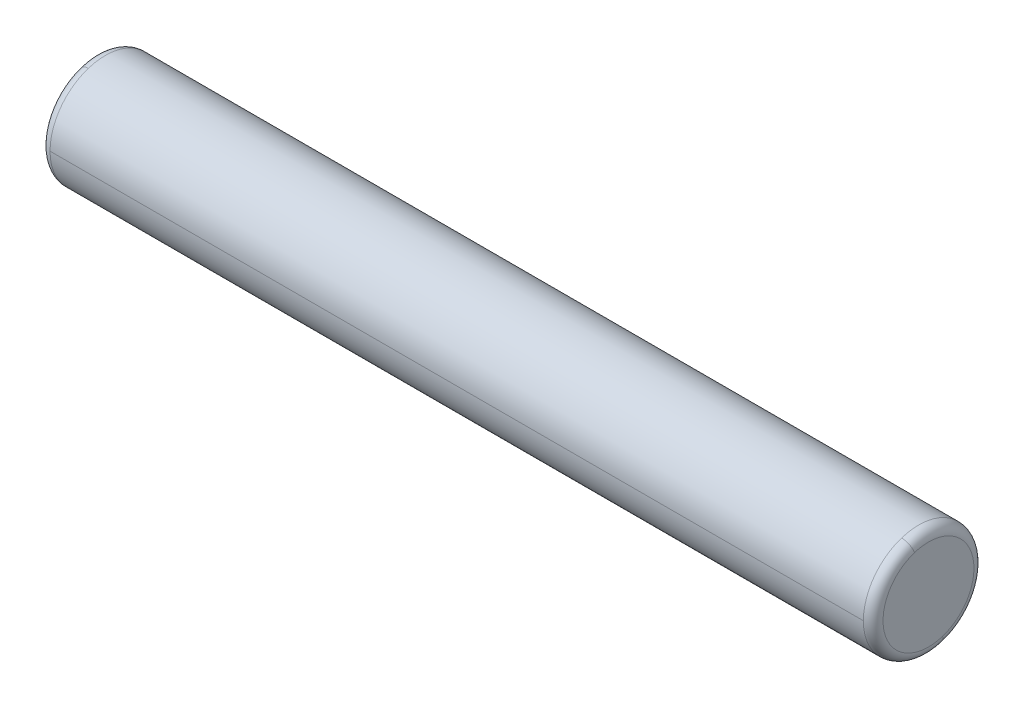
ISO-10303-21;
HEADER;
FILE_DESCRIPTION(('STEP AP214'),'2;1');
FILE_NAME('part.step','',(''),(''),'','','');
FILE_SCHEMA(('AUTOMOTIVE_DESIGN { 1 0 10303 214 1 1 1 1 }'));
ENDSEC;
DATA;
#1=APPLICATION_CONTEXT('core data for automotive mechanical design processes');
#2=APPLICATION_PROTOCOL_DEFINITION('international standard','automotive_design',2000,#1);
#3=PRODUCT_CONTEXT('',#1,'mechanical');
#4=PRODUCT('Part','Part','',(#3));
#5=PRODUCT_RELATED_PRODUCT_CATEGORY('part','',(#4));
#6=PRODUCT_DEFINITION_FORMATION('','',#4);
#7=PRODUCT_DEFINITION_CONTEXT('part definition',#1,'design');
#8=PRODUCT_DEFINITION('design','',#6,#7);
#9=PRODUCT_DEFINITION_SHAPE('','',#8);
#10=(LENGTH_UNIT() NAMED_UNIT(*) SI_UNIT(.MILLI.,.METRE.));
#11=(NAMED_UNIT(*) PLANE_ANGLE_UNIT() SI_UNIT($,.RADIAN.));
#12=(NAMED_UNIT(*) SI_UNIT($,.STERADIAN.) SOLID_ANGLE_UNIT());
#13=UNCERTAINTY_MEASURE_WITH_UNIT(LENGTH_MEASURE(1.E-05),#10,'distance_accuracy_value','');
#14=(GEOMETRIC_REPRESENTATION_CONTEXT(3) GLOBAL_UNCERTAINTY_ASSIGNED_CONTEXT((#13)) GLOBAL_UNIT_ASSIGNED_CONTEXT((#10,
#11,#12)) REPRESENTATION_CONTEXT('',''));
#15=CARTESIAN_POINT('',(0.,0.,0.));
#16=DIRECTION('',(0.,0.,1.));
#17=DIRECTION('',(1.,0.,0.));
#18=AXIS2_PLACEMENT_3D('',#15,#16,#17);
#19=CARTESIAN_POINT('',(1.85,5.75,0.));
#20=DIRECTION('',(1.,0.,0.));
#21=DIRECTION('',(0.,0.,-1.));
#22=AXIS2_PLACEMENT_3D('',#19,#20,#21);
#23=PLANE('',#22);
#24=CARTESIAN_POINT('',(1.85,6.33648485171543,0.190560479864581));
#25=CARTESIAN_POINT('',(1.85,6.33336701356857,0.200156891642519));
#26=CARTESIAN_POINT('',(1.85,6.33001325165227,0.209676627991157));
#27=CARTESIAN_POINT('',(1.85,6.32284283926946,0.228540150254757));
#28=CARTESIAN_POINT('',(1.85,6.31902618880294,0.23788393616972));
#29=CARTESIAN_POINT('',(1.85,6.31093895830836,0.256372957990897));
#30=CARTESIAN_POINT('',(1.85,6.30666837828029,0.265518193897111));
#31=CARTESIAN_POINT('',(1.85,6.29768364000794,0.283588108028384));
#32=CARTESIAN_POINT('',(1.85,6.29296948176366,0.292512786253444));
#33=CARTESIAN_POINT('',(1.85,6.28310892695962,0.310120078259559));
#34=CARTESIAN_POINT('',(1.85,6.27796253039987,0.318802692040616));
#35=CARTESIAN_POINT('',(1.85,6.26724990161851,0.335904939704879));
#36=CARTESIAN_POINT('',(1.85,6.2616836693969,0.344324573588087));
#37=CARTESIAN_POINT('',(1.85,6.25014477761805,0.360880577359409));
#38=CARTESIAN_POINT('',(1.85,6.2441721180608,0.369016947247524));
#39=CARTESIAN_POINT('',(1.85,6.23183476059616,0.384986821924664));
#40=CARTESIAN_POINT('',(1.85,6.22547006268878,0.392820326713689));
#41=CARTESIAN_POINT('',(1.85,6.2123639615514,0.408165599560326));
#42=CARTESIAN_POINT('',(1.85,6.20562255832141,0.415677367617938));
#43=CARTESIAN_POINT('',(1.85,6.19177928719304,0.430361070503428));
#44=CARTESIAN_POINT('',(1.85,6.18467741929466,0.437533005331306));
#45=CARTESIAN_POINT('',(1.85,6.17013032784508,0.451519763935761));
#46=CARTESIAN_POINT('',(1.85,6.16268510429388,0.458334587712338));
#47=CARTESIAN_POINT('',(1.85,6.14746923773599,0.471590706707441));
#48=CARTESIAN_POINT('',(1.85,6.1396985947293,0.478032001925968));
#49=CARTESIAN_POINT('',(1.85,6.12385060941961,0.490525546160429));
#50=CARTESIAN_POINT('',(1.85,6.11577326711661,0.496577795176363));
#51=CARTESIAN_POINT('',(1.85,6.09933134223953,0.508278666607691));
#52=CARTESIAN_POINT('',(1.85,6.09096675966544,0.513927289023084));
#53=CARTESIAN_POINT('',(1.85,6.07397050525822,0.524807299227158));
#54=CARTESIAN_POINT('',(1.85,6.06533883342509,0.530038687015839));
#55=CARTESIAN_POINT('',(1.85,6.04782919495327,0.540071625095092));
#56=CARTESIAN_POINT('',(1.85,6.03895122831459,0.544873175385665));
#57=CARTESIAN_POINT('',(1.85,6.02097038803093,0.554034871113486));
#58=CARTESIAN_POINT('',(1.85,6.01186751438595,0.558395016550734));
#59=CARTESIAN_POINT('',(1.85,5.99345878970962,0.566663398599644));
#60=CARTESIAN_POINT('',(1.85,5.98415293867826,0.570571635211305));
#61=CARTESIAN_POINT('',(1.85,5.96536067783942,0.577926784324724));
#62=CARTESIAN_POINT('',(1.85,5.95587426803193,0.58137369682648));
#63=CARTESIAN_POINT('',(1.85,5.93674374323294,0.587797893805957));
#64=CARTESIAN_POINT('',(1.85,5.92709962824145,0.590775178283678));
#65=CARTESIAN_POINT('',(1.85,5.90767692659219,0.596252946675997));
#66=CARTESIAN_POINT('',(1.85,5.89789833993443,0.598753430590596));
#67=CARTESIAN_POINT('',(1.85,5.87823025242442,0.603271573971905));
#68=CARTESIAN_POINT('',(1.85,5.86834075157216,0.605289233438615));
#69=CARTESIAN_POINT('',(1.85,5.84847466034691,0.608836867205765));
#70=CARTESIAN_POINT('',(1.85,5.83849806997392,0.610366841506205));
#71=CARTESIAN_POINT('',(1.85,5.81848183418726,0.612935419098715));
#72=CARTESIAN_POINT('',(1.85,5.8084421887736,0.613974022390786));
#73=CARTESIAN_POINT('',(1.85,5.78832402929076,0.615557355880255));
#74=CARTESIAN_POINT('',(1.85,5.77824551522159,0.616102086077654));
#75=CARTESIAN_POINT('',(1.85,5.7580738984509,0.616696361075022));
#76=CARTESIAN_POINT('',(1.85,5.74798079574939,0.616745905874992));
#77=CARTESIAN_POINT('',(1.85,5.72780431688249,0.616349690719738));
#78=CARTESIAN_POINT('',(1.85,5.7177209407171,0.615903930764515));
#79=CARTESIAN_POINT('',(1.85,5.69758820665882,0.614518179973653));
#80=CARTESIAN_POINT('',(1.85,5.68753884876593,0.613578189138014));
#81=CARTESIAN_POINT('',(1.85,5.66749836103604,0.611206241106576));
#82=CARTESIAN_POINT('',(1.85,5.65750723119904,0.609774283910778));
#83=CARTESIAN_POINT('',(1.85,5.63760726908782,0.60642185286933));
#84=CARTESIAN_POINT('',(1.85,5.6276984368136,0.604501379023681));
#85=CARTESIAN_POINT('',(1.85,5.6079869410728,0.60017654127224));
#86=CARTESIAN_POINT('',(1.85,5.59818427760622,0.597772177366449));
#87=CARTESIAN_POINT('',(1.85,5.57870873495561,0.592485351817969));
#88=CARTESIAN_POINT('',(1.85,5.56903585577158,0.589602890175282));
#89=CARTESIAN_POINT('',(1.85,5.54984318449926,0.583366813255581));
#90=CARTESIAN_POINT('',(1.85,5.54032339241097,0.580013197978569));
#91=CARTESIAN_POINT('',(1.85,5.52145982934311,0.572842892943162));
#92=CARTESIAN_POINT('',(1.85,5.51211605836355,0.569026203184769));
#93=CARTESIAN_POINT('',(1.85,5.49362704747584,0.560938943926532));
#94=CARTESIAN_POINT('',(1.85,5.4844818075677,0.556668374426689));
#95=CARTESIAN_POINT('',(1.85,5.46641189050681,0.547683643861534));
#96=CARTESIAN_POINT('',(1.85,5.45748721335406,0.542969482796223));
#97=CARTESIAN_POINT('',(1.85,5.43987992213293,0.533108925927052));
#98=CARTESIAN_POINT('',(1.85,5.43119730806455,0.527962530123192));
#99=CARTESIAN_POINT('',(1.85,5.41409506018995,0.517249901895185));
#100=CARTESIAN_POINT('',(1.85,5.40567542638373,0.511683669471038));
#101=CARTESIAN_POINT('',(1.85,5.38911942266877,0.500144777543911));
#102=CARTESIAN_POINT('',(1.85,5.38098305276003,0.494172118040932));
#103=CARTESIAN_POINT('',(1.85,5.36501317806779,0.481834760616026));
#104=CARTESIAN_POINT('',(1.85,5.35717967328429,0.4754700626941));
#105=CARTESIAN_POINT('',(1.85,5.3418344004417,0.462363961546076));
#106=CARTESIAN_POINT('',(1.85,5.33432263238261,0.455622558319979));
#107=CARTESIAN_POINT('',(1.85,5.31963892949603,0.441779287194462));
#108=CARTESIAN_POINT('',(1.85,5.31246699466855,0.434677419295042));
#109=CARTESIAN_POINT('',(1.85,5.29848023606438,0.420130327844701));
#110=CARTESIAN_POINT('',(1.85,5.2916654122877,0.412685104293779));
#111=CARTESIAN_POINT('',(1.85,5.27840929329252,0.397469237736091));
#112=CARTESIAN_POINT('',(1.85,5.27196799807402,0.389698594729325));
#113=CARTESIAN_POINT('',(1.85,5.25947445383958,0.373850609419582));
#114=CARTESIAN_POINT('',(1.85,5.25342220482364,0.365773267116604));
#115=CARTESIAN_POINT('',(1.85,5.24172133339231,0.349331342239535));
#116=CARTESIAN_POINT('',(1.85,5.23607271097691,0.340966759665444));
#117=CARTESIAN_POINT('',(1.85,5.22519270077284,0.323970505258221));
#118=CARTESIAN_POINT('',(1.85,5.21996131298416,0.315338833425089));
#119=CARTESIAN_POINT('',(1.85,5.20992837490491,0.297829194953275));
#120=CARTESIAN_POINT('',(1.85,5.20512682461433,0.288951228314593));
#121=CARTESIAN_POINT('',(1.85,5.19596512888651,0.27097038803093));
#122=CARTESIAN_POINT('',(1.85,5.19160498344927,0.261867514385949));
#123=CARTESIAN_POINT('',(1.85,5.18333660140036,0.243458789709615));
#124=CARTESIAN_POINT('',(1.85,5.17942836478869,0.234152938678263));
#125=CARTESIAN_POINT('',(1.85,5.17207321567528,0.21536067783942));
#126=CARTESIAN_POINT('',(1.85,5.16862630317353,0.20587426803193));
#127=CARTESIAN_POINT('',(1.85,5.16220210619404,0.186743743232939));
#128=CARTESIAN_POINT('',(1.85,5.15922482171629,0.177099628241439));
#129=CARTESIAN_POINT('',(1.85,5.15374705332403,0.157676926592202));
#130=CARTESIAN_POINT('',(1.85,5.15124656940951,0.147898339934465));
#131=CARTESIAN_POINT('',(1.85,5.14672842602799,0.12823025242439));
#132=CARTESIAN_POINT('',(1.85,5.14471076656099,0.118340751572052));
#133=CARTESIAN_POINT('',(1.85,5.14116313279463,0.0984746603470164));
#134=CARTESIAN_POINT('',(1.85,5.13963315849527,0.0884980699743187));
#135=CARTESIAN_POINT('',(1.85,5.13706458089981,0.0684818341868628));
#136=CARTESIAN_POINT('',(1.85,5.13602597760372,0.0584421887721046));
#137=CARTESIAN_POINT('',(1.85,5.13444264412524,0.0383240292922504));
#138=CARTESIAN_POINT('',(1.85,5.13389791394285,0.0282455152271545));
#139=CARTESIAN_POINT('',(1.85,5.13330363890447,0.00807389844533762));
#140=CARTESIAN_POINT('',(1.85,5.13325409404847,-0.00201920427138334));
#141=CARTESIAN_POINT('',(1.85,5.1336503093568,-0.0221956830967294));
#142=CARTESIAN_POINT('',(1.85,5.13409606952114,-0.0322790592053546));
#143=CARTESIAN_POINT('',(1.85,5.13548181974069,-0.0524117934187199));
#144=CARTESIAN_POINT('',(1.85,5.13642180979592,-0.0624611515234601));
#145=CARTESIAN_POINT('',(1.85,5.13879375995949,-0.0825016386745627));
#146=CARTESIAN_POINT('',(1.85,5.14022572006784,-0.0924927677209251));
#147=CARTESIAN_POINT('',(1.85,5.14357814315205,-0.112392731992217));
#148=CARTESIAN_POINT('',(1.85,5.14549860612791,-0.122301567217147));
#149=CARTESIAN_POINT('',(1.85,5.14982347357617,-0.142013054896456));
#150=CARTESIAN_POINT('',(1.85,5.15222787804856,-0.151815707350834));
#151=CARTESIAN_POINT('',(1.85,5.15751459276702,-0.171291280087331));
#152=CARTESIAN_POINT('',(1.85,5.16039690301309,-0.180964200369448));
#153=CARTESIAN_POINT('',(1.85,5.16351514828457,-0.190560479864579));
#154=B_SPLINE_CURVE_WITH_KNOTS('',3,(#24,#25,#26,#27,#28,#29,#30,#31,#32,#33,#34,#35,#36,#37,
#38,#39,#40,#41,#42,#43,#44,#45,#46,#47,#48,#49,#50,#51,#52,#53,#54,#55,#56,#57,#58,#59,#60,#61,
#62,#63,#64,#65,#66,#67,#68,#69,#70,#71,#72,#73,#74,#75,#76,#77,#78,#79,#80,#81,#82,#83,#84,#85,
#86,#87,#88,#89,#90,#91,#92,#93,#94,#95,#96,#97,#98,#99,#100,#101,#102,#103,#104,#105,#106,#107,
#108,#109,#110,#111,#112,#113,#114,#115,#116,#117,#118,#119,#120,#121,#122,#123,#124,#125,#126,
#127,#128,#129,#130,#131,#132,#133,#134,#135,#136,#137,#138,#139,#140,#141,#142,#143,#144,#145,
#146,#147,#148,#149,#150,#151,#152,#153),.UNSPECIFIED.,.F.,.F.,(4,2,2,2,2,2,2,2,2,2,2,2,2,2,2,2,
2,2,2,2,2,2,2,2,2,2,2,2,2,2,2,2,2,2,2,2,2,2,2,2,2,2,2,2,2,2,2,2,2,2,2,2,2,2,2,2,2,2,2,2,2,2,2,2,
4),(0.,0.030267515178263,0.060535030356526,0.0908025455347889,0.121070060713052,
0.151337575891315,0.181605091069578,0.211872606247841,0.242140121426104,0.272407636604367,
0.302675151782629,0.332942666960893,0.363210182139156,0.393477697317419,0.423745212495682,
0.454012727673945,0.484280242852208,0.514547758030471,0.544815273208733,0.575082788386997,
0.605350303565259,0.635617818743522,0.665885333921785,0.696152849100048,0.726420364278311,
0.756687879456575,0.786955394634838,0.8172229098131,0.847490424991363,0.877757940169626,
0.908025455347889,0.938292970526152,0.968560485704415,0.998828000882678,1.02909551606094,
1.0593630312392,1.08963054641747,1.11989806159573,1.15016557677399,1.18043309195226,
1.21070060713052,1.24096812230878,1.27123563748704,1.30150315266531,1.33177066784357,
1.36203818302183,1.3923056982001,1.42257321337836,1.45284072855662,1.48310824373489,
1.51337575891315,1.54364327409141,1.57391078926967,1.60417830444794,1.6344458196262,
1.66471333480446,1.69498084998273,1.72524836516099,1.75551588033925,1.78578339551752,
1.81605091069578,1.84631842587404,1.8765859410523,1.90685345623057,1.93712097140883),.UNSPECIFIED.);
#155=CARTESIAN_POINT('',(1.85,6.33648485171543,0.190560479864579));
#156=VERTEX_POINT('',#155);
#157=CARTESIAN_POINT('',(1.85,5.16351514828457,-0.190560479864579));
#158=VERTEX_POINT('',#157);
#159=EDGE_CURVE('E11',#156,#158,#154,.T.);
#160=ORIENTED_EDGE('',*,*,#159,.F.);
#161=CARTESIAN_POINT('',(1.85,5.16351514828457,-0.190560479864581));
#162=CARTESIAN_POINT('',(1.85,5.16663298643143,-0.200156891642519));
#163=CARTESIAN_POINT('',(1.85,5.16998674834773,-0.209676627991157));
#164=CARTESIAN_POINT('',(1.85,5.17715716073054,-0.228540150254757));
#165=CARTESIAN_POINT('',(1.85,5.18097381119706,-0.23788393616972));
#166=CARTESIAN_POINT('',(1.85,5.18906104169164,-0.256372957990897));
#167=CARTESIAN_POINT('',(1.85,5.19333162171971,-0.265518193897111));
#168=CARTESIAN_POINT('',(1.85,5.20231635999206,-0.283588108028384));
#169=CARTESIAN_POINT('',(1.85,5.20703051823634,-0.292512786253444));
#170=CARTESIAN_POINT('',(1.85,5.21689107304038,-0.310120078259559));
#171=CARTESIAN_POINT('',(1.85,5.22203746960013,-0.318802692040615));
#172=CARTESIAN_POINT('',(1.85,5.23275009838149,-0.335904939704879));
#173=CARTESIAN_POINT('',(1.85,5.2383163306031,-0.344324573588086));
#174=CARTESIAN_POINT('',(1.85,5.24985522238195,-0.360880577359409));
#175=CARTESIAN_POINT('',(1.85,5.2558278819392,-0.369016947247524));
#176=CARTESIAN_POINT('',(1.85,5.26816523940384,-0.384986821924664));
#177=CARTESIAN_POINT('',(1.85,5.27452993731122,-0.392820326713689));
#178=CARTESIAN_POINT('',(1.85,5.2876360384486,-0.408165599560325));
#179=CARTESIAN_POINT('',(1.85,5.29437744167859,-0.415677367617937));
#180=CARTESIAN_POINT('',(1.85,5.30822071280696,-0.430361070503428));
#181=CARTESIAN_POINT('',(1.85,5.31532258070534,-0.437533005331306));
#182=CARTESIAN_POINT('',(1.85,5.32986967215492,-0.451519763935761));
#183=CARTESIAN_POINT('',(1.85,5.33731489570612,-0.458334587712337));
#184=CARTESIAN_POINT('',(1.85,5.35253076226401,-0.471590706707441));
#185=CARTESIAN_POINT('',(1.85,5.3603014052707,-0.478032001925968));
#186=CARTESIAN_POINT('',(1.85,5.37614939058039,-0.490525546160429));
#187=CARTESIAN_POINT('',(1.85,5.38422673288339,-0.496577795176363));
#188=CARTESIAN_POINT('',(1.85,5.40066865776047,-0.50827866660769));
#189=CARTESIAN_POINT('',(1.85,5.40903324033456,-0.513927289023084));
#190=CARTESIAN_POINT('',(1.85,5.42602949474178,-0.524807299227158));
#191=CARTESIAN_POINT('',(1.85,5.43466116657491,-0.530038687015838));
#192=CARTESIAN_POINT('',(1.85,5.45217080504673,-0.540071625095092));
#193=CARTESIAN_POINT('',(1.85,5.46104877168541,-0.544873175385665));
#194=CARTESIAN_POINT('',(1.85,5.47902961196907,-0.554034871113486));
#195=CARTESIAN_POINT('',(1.85,5.48813248561405,-0.558395016550734));
#196=CARTESIAN_POINT('',(1.85,5.50654121029038,-0.566663398599644));
#197=CARTESIAN_POINT('',(1.85,5.51584706132174,-0.570571635211305));
#198=CARTESIAN_POINT('',(1.85,5.53463932216058,-0.577926784324723));
#199=CARTESIAN_POINT('',(1.85,5.54412573196807,-0.58137369682648));
#200=CARTESIAN_POINT('',(1.85,5.56325625676706,-0.587797893805957));
#201=CARTESIAN_POINT('',(1.85,5.57290037175855,-0.590775178283678));
#202=CARTESIAN_POINT('',(1.85,5.59232307340781,-0.596252946675997));
#203=CARTESIAN_POINT('',(1.85,5.60210166006556,-0.598753430590596));
#204=CARTESIAN_POINT('',(1.85,5.62176974757558,-0.603271573971905));
#205=CARTESIAN_POINT('',(1.85,5.63165924842784,-0.605289233438615));
#206=CARTESIAN_POINT('',(1.85,5.65152533965309,-0.608836867205765));
#207=CARTESIAN_POINT('',(1.85,5.66150193002608,-0.610366841506205));
#208=CARTESIAN_POINT('',(1.85,5.68151816581274,-0.612935419098715));
#209=CARTESIAN_POINT('',(1.85,5.6915578112264,-0.613974022390785));
#210=CARTESIAN_POINT('',(1.85,5.71167597070924,-0.615557355880255));
#211=CARTESIAN_POINT('',(1.85,5.72175448477841,-0.616102086077654));
#212=CARTESIAN_POINT('',(1.85,5.74192610154909,-0.616696361075022));
#213=CARTESIAN_POINT('',(1.85,5.75201920425061,-0.616745905874991));
#214=CARTESIAN_POINT('',(1.85,5.77219568311751,-0.616349690719738));
#215=CARTESIAN_POINT('',(1.85,5.7822790592829,-0.615903930764515));
#216=CARTESIAN_POINT('',(1.85,5.80241179334118,-0.614518179973653));
#217=CARTESIAN_POINT('',(1.85,5.81246115123407,-0.613578189138014));
#218=CARTESIAN_POINT('',(1.85,5.83250163896396,-0.611206241106577));
#219=CARTESIAN_POINT('',(1.85,5.84249276880096,-0.609774283910778));
#220=CARTESIAN_POINT('',(1.85,5.86239273091218,-0.60642185286933));
#221=CARTESIAN_POINT('',(1.85,5.8723015631864,-0.604501379023681));
#222=CARTESIAN_POINT('',(1.85,5.8920130589272,-0.60017654127224));
#223=CARTESIAN_POINT('',(1.85,5.90181572239378,-0.597772177366449));
#224=CARTESIAN_POINT('',(1.85,5.92129126504439,-0.59248535181797));
#225=CARTESIAN_POINT('',(1.85,5.93096414422842,-0.589602890175282));
#226=CARTESIAN_POINT('',(1.85,5.95015681550074,-0.583366813255582));
#227=CARTESIAN_POINT('',(1.85,5.95967660758903,-0.580013197978569));
#228=CARTESIAN_POINT('',(1.85,5.97854017065688,-0.572842892943163));
#229=CARTESIAN_POINT('',(1.85,5.98788394163645,-0.569026203184769));
#230=CARTESIAN_POINT('',(1.85,6.00637295252416,-0.560938943926533));
#231=CARTESIAN_POINT('',(1.85,6.0155181924323,-0.556668374426689));
#232=CARTESIAN_POINT('',(1.85,6.03358810949319,-0.547683643861534));
#233=CARTESIAN_POINT('',(1.85,6.04251278664594,-0.542969482796224));
#234=CARTESIAN_POINT('',(1.85,6.06012007786706,-0.533108925927053));
#235=CARTESIAN_POINT('',(1.85,6.06880269193544,-0.527962530123192));
#236=CARTESIAN_POINT('',(1.85,6.08590493981005,-0.517249901895185));
#237=CARTESIAN_POINT('',(1.85,6.09432457361627,-0.511683669471039));
#238=CARTESIAN_POINT('',(1.85,6.11088057733123,-0.500144777543912));
#239=CARTESIAN_POINT('',(1.85,6.11901694723997,-0.494172118040933));
#240=CARTESIAN_POINT('',(1.85,6.13498682193221,-0.481834760616027));
#241=CARTESIAN_POINT('',(1.85,6.14282032671571,-0.475470062694101));
#242=CARTESIAN_POINT('',(1.85,6.1581655995583,-0.462363961546077));
#243=CARTESIAN_POINT('',(1.85,6.16567736761739,-0.45562255831998));
#244=CARTESIAN_POINT('',(1.85,6.18036107050397,-0.441779287194463));
#245=CARTESIAN_POINT('',(1.85,6.18753300533145,-0.434677419295043));
#246=CARTESIAN_POINT('',(1.85,6.20151976393561,-0.420130327844702));
#247=CARTESIAN_POINT('',(1.85,6.2083345877123,-0.41268510429378));
#248=CARTESIAN_POINT('',(1.85,6.22159070670748,-0.397469237736092));
#249=CARTESIAN_POINT('',(1.85,6.22803200192598,-0.389698594729326));
#250=CARTESIAN_POINT('',(1.85,6.24052554616042,-0.373850609419583));
#251=CARTESIAN_POINT('',(1.85,6.24657779517636,-0.365773267116605));
#252=CARTESIAN_POINT('',(1.85,6.25827866660769,-0.349331342239536));
#253=CARTESIAN_POINT('',(1.85,6.26392728902308,-0.340966759665445));
#254=CARTESIAN_POINT('',(1.85,6.27480729922716,-0.323970505258222));
#255=CARTESIAN_POINT('',(1.85,6.28003868701584,-0.31533883342509));
#256=CARTESIAN_POINT('',(1.85,6.29007162509509,-0.297829194953276));
#257=CARTESIAN_POINT('',(1.85,6.29487317538566,-0.288951228314595));
#258=CARTESIAN_POINT('',(1.85,6.30403487111349,-0.270970388030932));
#259=CARTESIAN_POINT('',(1.85,6.30839501655073,-0.26186751438595));
#260=CARTESIAN_POINT('',(1.85,6.31666339859964,-0.243458789709617));
#261=CARTESIAN_POINT('',(1.85,6.32057163521131,-0.234152938678265));
#262=CARTESIAN_POINT('',(1.85,6.32792678432472,-0.215360677839422));
#263=CARTESIAN_POINT('',(1.85,6.33137369682647,-0.205874268031931));
#264=CARTESIAN_POINT('',(1.85,6.33779789380596,-0.18674374323294));
#265=CARTESIAN_POINT('',(1.85,6.3407751782837,-0.17709962824144));
#266=CARTESIAN_POINT('',(1.85,6.34625294667597,-0.157676926592203));
#267=CARTESIAN_POINT('',(1.85,6.34875343059049,-0.147898339934466));
#268=CARTESIAN_POINT('',(1.85,6.35327157397201,-0.128230252424392));
#269=CARTESIAN_POINT('',(1.85,6.35528923343901,-0.118340751572054));
#270=CARTESIAN_POINT('',(1.85,6.35883686720537,-0.0984746603470183));
#271=CARTESIAN_POINT('',(1.85,6.36036684150473,-0.0884980699743207));
#272=CARTESIAN_POINT('',(1.85,6.36293541910019,-0.068481834186865));
#273=CARTESIAN_POINT('',(1.85,6.36397402239628,-0.0584421887721069));
#274=CARTESIAN_POINT('',(1.85,6.36555735587476,-0.0383240292922528));
#275=CARTESIAN_POINT('',(1.85,6.36610208605715,-0.0282455152271568));
#276=CARTESIAN_POINT('',(1.85,6.36669636109553,-0.00807389844533986));
#277=CARTESIAN_POINT('',(1.85,6.36674590595153,0.00201920427138107));
#278=CARTESIAN_POINT('',(1.85,6.3663496906432,0.0221956830967272));
#279=CARTESIAN_POINT('',(1.85,6.36590393047886,0.0322790592053523));
#280=CARTESIAN_POINT('',(1.85,6.36451818025931,0.0524117934187176));
#281=CARTESIAN_POINT('',(1.85,6.36357819020408,0.0624611515234578));
#282=CARTESIAN_POINT('',(1.85,6.36120624004051,0.0825016386745604));
#283=CARTESIAN_POINT('',(1.85,6.35977427993216,0.0924927677209228));
#284=CARTESIAN_POINT('',(1.85,6.35642185684795,0.112392731992215));
#285=CARTESIAN_POINT('',(1.85,6.35450139387209,0.122301567217145));
#286=CARTESIAN_POINT('',(1.85,6.35017652642383,0.142013054896454));
#287=CARTESIAN_POINT('',(1.85,6.34777212195144,0.151815707350832));
#288=CARTESIAN_POINT('',(1.85,6.34248540723298,0.171291280087328));
#289=CARTESIAN_POINT('',(1.85,6.33960309698691,0.180964200369446));
#290=CARTESIAN_POINT('',(1.85,6.33648485171543,0.190560479864577));
#291=B_SPLINE_CURVE_WITH_KNOTS('',3,(#161,#162,#163,#164,#165,#166,#167,#168,#169,#170,#171,
#172,#173,#174,#175,#176,#177,#178,#179,#180,#181,#182,#183,#184,#185,#186,#187,#188,#189,#190,
#191,#192,#193,#194,#195,#196,#197,#198,#199,#200,#201,#202,#203,#204,#205,#206,#207,#208,#209,
#210,#211,#212,#213,#214,#215,#216,#217,#218,#219,#220,#221,#222,#223,#224,#225,#226,#227,#228,
#229,#230,#231,#232,#233,#234,#235,#236,#237,#238,#239,#240,#241,#242,#243,#244,#245,#246,#247,
#248,#249,#250,#251,#252,#253,#254,#255,#256,#257,#258,#259,#260,#261,#262,#263,#264,#265,#266,
#267,#268,#269,#270,#271,#272,#273,#274,#275,#276,#277,#278,#279,#280,#281,#282,#283,#284,#285,
#286,#287,#288,#289,#290),.UNSPECIFIED.,.F.,.F.,(4,2,2,2,2,2,2,2,2,2,2,2,2,2,2,2,2,2,2,2,2,2,2,
2,2,2,2,2,2,2,2,2,2,2,2,2,2,2,2,2,2,2,2,2,2,2,2,2,2,2,2,2,2,2,2,2,2,2,2,2,2,2,2,2,4),(0.,
0.030267515178263,0.0605350303565261,0.0908025455347888,0.121070060713052,0.151337575891315,
0.181605091069578,0.211872606247841,0.242140121426104,0.272407636604367,0.302675151782629,
0.332942666960892,0.363210182139155,0.393477697317418,0.423745212495681,0.454012727673944,
0.484280242852207,0.51454775803047,0.544815273208733,0.575082788386996,0.605350303565258,
0.635617818743521,0.665885333921785,0.696152849100047,0.72642036427831,0.756687879456574,
0.786955394634837,0.817222909813099,0.847490424991362,0.877757940169625,0.908025455347888,
0.938292970526151,0.968560485704414,0.998828000882677,1.02909551606094,1.0593630312392,
1.08963054641747,1.11989806159573,1.15016557677399,1.18043309195225,1.21070060713052,
1.24096812230878,1.27123563748704,1.30150315266531,1.33177066784357,1.36203818302183,
1.39230569820009,1.42257321337836,1.45284072855662,1.48310824373488,1.51337575891315,
1.54364327409141,1.57391078926967,1.60417830444794,1.6344458196262,1.66471333480446,
1.69498084998272,1.72524836516099,1.75551588033925,1.78578339551751,1.81605091069578,
1.84631842587404,1.8765859410523,1.90685345623057,1.93712097140883),.UNSPECIFIED.);
#292=EDGE_CURVE('E25',#158,#156,#291,.T.);
#293=ORIENTED_EDGE('',*,*,#292,.F.);
#294=EDGE_LOOP('',(#160,#293));
#295=FACE_BOUND('',#294,.T.);
#296=ADVANCED_FACE('F16',(#295),#23,.F.);
#297=CARTESIAN_POINT('',(1.98333333333324,5.75,0.));
#298=DIRECTION('',(1.,0.,0.));
#299=DIRECTION('',(0.,-0.309016994374947,0.951056516295154));
#300=AXIS2_PLACEMENT_3D('',#297,#298,#299);
#301=TOROIDAL_SURFACE('',#300,0.616666666666758,0.133333333333242);
#302=CARTESIAN_POINT('',(1.98333333333324,5.16351514828457,-0.190560479864579));
#303=DIRECTION('',(0.,0.309016994374948,-0.951056516295153));
#304=DIRECTION('',(4.51305659510436E-13,-0.951056516295153,-0.309016994374948));
#305=AXIS2_PLACEMENT_3D('',#302,#303,#304);
#306=CIRCLE('',#305,0.133333333333242);
#307=CARTESIAN_POINT('',(1.9833333333333,5.03670761277863,-0.23176274578121));
#308=VERTEX_POINT('',#307);
#309=EDGE_CURVE('E138',#308,#158,#306,.T.);
#310=ORIENTED_EDGE('',*,*,#309,.T.);
#311=ORIENTED_EDGE('',*,*,#292,.T.);
#312=CARTESIAN_POINT('',(1.98333333333324,6.33648485171543,0.190560479864579));
#313=DIRECTION('',(0.,-0.309016994374948,0.951056516295153));
#314=DIRECTION('',(4.52970994047375E-13,0.951056516295153,0.309016994374948));
#315=AXIS2_PLACEMENT_3D('',#312,#313,#314);
#316=CIRCLE('',#315,0.133333333333242);
#317=CARTESIAN_POINT('',(1.9833333333333,6.46329238722137,0.231762745781211));
#318=VERTEX_POINT('',#317);
#319=EDGE_CURVE('E134',#318,#156,#316,.T.);
#320=ORIENTED_EDGE('',*,*,#319,.F.);
#321=CARTESIAN_POINT('',(1.9833333333333,5.75,0.));
#322=DIRECTION('',(1.,0.,0.));
#323=DIRECTION('',(0.,0.,-1.));
#324=AXIS2_PLACEMENT_3D('',#321,#322,#323);
#325=CIRCLE('',#324,0.75);
#326=CARTESIAN_POINT('',(1.9833333333333,5.75,-0.75));
#327=VERTEX_POINT('',#326);
#328=EDGE_CURVE('E129',#327,#318,#325,.T.);
#329=ORIENTED_EDGE('',*,*,#328,.F.);
#330=CARTESIAN_POINT('',(1.9833333333333,5.75,0.));
#331=DIRECTION('',(1.,0.,0.));
#332=DIRECTION('',(0.,0.,-1.));
#333=AXIS2_PLACEMENT_3D('',#330,#331,#332);
#334=CIRCLE('',#333,0.75);
#335=EDGE_CURVE('E124',#308,#327,#334,.T.);
#336=ORIENTED_EDGE('',*,*,#335,.F.);
#337=EDGE_LOOP('',(#310,#311,#320,#329,#336));
#338=FACE_BOUND('',#337,.T.);
#339=ADVANCED_FACE('F145',(#338),#301,.T.);
#340=CARTESIAN_POINT('',(13.15,5.75,0.));
#341=DIRECTION('',(1.,0.,0.));
#342=DIRECTION('',(0.,1.,0.));
#343=AXIS2_PLACEMENT_3D('',#340,#341,#342);
#344=CYLINDRICAL_SURFACE('',#343,0.75);
#345=DIRECTION('',(1.,0.,0.));
#346=VECTOR('',#345,1.);
#347=CARTESIAN_POINT('',(1.9833333333333,5.75,0.75));
#348=LINE('',#347,#346);
#349=CARTESIAN_POINT('',(1.9833333333333,5.75,0.75));
#350=VERTEX_POINT('',#349);
#351=CARTESIAN_POINT('',(13.016666666667,5.75,0.75));
#352=VERTEX_POINT('',#351);
#353=EDGE_CURVE('E91',#350,#352,#348,.T.);
#354=ORIENTED_EDGE('',*,*,#353,.F.);
#355=CARTESIAN_POINT('',(1.9833333333333,5.75,0.));
#356=DIRECTION('',(1.,0.,0.));
#357=DIRECTION('',(0.,0.,-1.));
#358=AXIS2_PLACEMENT_3D('',#355,#356,#357);
#359=CIRCLE('',#358,0.75);
#360=EDGE_CURVE('E116',#350,#308,#359,.T.);
#361=ORIENTED_EDGE('',*,*,#360,.T.);
#362=ORIENTED_EDGE('',*,*,#335,.T.);
#363=DIRECTION('',(1.,0.,0.));
#364=VECTOR('',#363,1.);
#365=CARTESIAN_POINT('',(1.9833333333333,5.75,-0.75));
#366=LINE('',#365,#364);
#367=CARTESIAN_POINT('',(13.016666666667,5.75,-0.75));
#368=VERTEX_POINT('',#367);
#369=EDGE_CURVE('E112',#327,#368,#366,.T.);
#370=ORIENTED_EDGE('',*,*,#369,.T.);
#371=CARTESIAN_POINT('',(13.016666666667,5.75,0.));
#372=DIRECTION('',(1.,0.,0.));
#373=DIRECTION('',(0.,0.,-1.));
#374=AXIS2_PLACEMENT_3D('',#371,#372,#373);
#375=CIRCLE('',#374,0.75);
#376=CARTESIAN_POINT('',(13.016666666667,5.03670761277863,-0.231762745781211));
#377=VERTEX_POINT('',#376);
#378=EDGE_CURVE('E83',#377,#368,#375,.T.);
#379=ORIENTED_EDGE('',*,*,#378,.F.);
#380=CARTESIAN_POINT('',(13.016666666667,5.75,0.));
#381=DIRECTION('',(1.,0.,0.));
#382=DIRECTION('',(0.,0.,-1.));
#383=AXIS2_PLACEMENT_3D('',#380,#381,#382);
#384=CIRCLE('',#383,0.75);
#385=EDGE_CURVE('E105',#352,#377,#384,.T.);
#386=ORIENTED_EDGE('',*,*,#385,.F.);
#387=EDGE_LOOP('',(#354,#361,#362,#370,#379,#386));
#388=FACE_BOUND('',#387,.T.);
#389=ADVANCED_FACE('F154',(#388),#344,.T.);
#390=CARTESIAN_POINT('',(13.0166666666669,5.75,0.));
#391=DIRECTION('',(1.,0.,0.));
#392=DIRECTION('',(0.,0.309016994374947,-0.951056516295154));
#393=AXIS2_PLACEMENT_3D('',#390,#391,#392);
#394=TOROIDAL_SURFACE('',#393,0.616666666666929,0.133333333333071);
#395=CARTESIAN_POINT('',(13.0166666666669,5.16351514828441,-0.190560479864632));
#396=DIRECTION('',(0.,0.309016994374947,-0.951056516295154));
#397=DIRECTION('',(1.,0.,0.));
#398=AXIS2_PLACEMENT_3D('',#395,#396,#397);
#399=CIRCLE('',#398,0.133333333333072);
#400=CARTESIAN_POINT('',(13.15,5.16351514828441,-0.190560479864632));
#401=VERTEX_POINT('',#400);
#402=EDGE_CURVE('E101',#401,#377,#399,.T.);
#403=ORIENTED_EDGE('',*,*,#402,.F.);
#404=CARTESIAN_POINT('',(13.15,5.75,0.));
#405=DIRECTION('',(1.,0.,0.));
#406=DIRECTION('',(0.,0.,-1.));
#407=AXIS2_PLACEMENT_3D('',#404,#405,#406);
#408=CIRCLE('',#407,0.6166666666667);
#409=CARTESIAN_POINT('',(13.15,6.33648485171559,0.190560479864632));
#410=VERTEX_POINT('',#409);
#411=EDGE_CURVE('E73',#410,#401,#408,.T.);
#412=ORIENTED_EDGE('',*,*,#411,.F.);
#413=CARTESIAN_POINT('',(13.0166666666669,6.33648485171559,0.190560479864632));
#414=DIRECTION('',(0.,-0.309016994374947,0.951056516295154));
#415=DIRECTION('',(1.,0.,0.));
#416=AXIS2_PLACEMENT_3D('',#413,#414,#415);
#417=CIRCLE('',#416,0.133333333333072);
#418=CARTESIAN_POINT('',(13.016666666667,6.46329238722137,0.231762745781211));
#419=VERTEX_POINT('',#418);
#420=EDGE_CURVE('E66',#410,#419,#417,.T.);
#421=ORIENTED_EDGE('',*,*,#420,.T.);
#422=CARTESIAN_POINT('',(13.016666666667,5.75,0.));
#423=DIRECTION('',(1.,0.,0.));
#424=DIRECTION('',(0.,0.,-1.));
#425=AXIS2_PLACEMENT_3D('',#422,#423,#424);
#426=CIRCLE('',#425,0.75);
#427=EDGE_CURVE('E71',#419,#352,#426,.T.);
#428=ORIENTED_EDGE('',*,*,#427,.T.);
#429=ORIENTED_EDGE('',*,*,#385,.T.);
#430=EDGE_LOOP('',(#403,#412,#421,#428,#429));
#431=FACE_BOUND('',#430,.T.);
#432=ADVANCED_FACE('F68',(#431),#394,.T.);
#433=CARTESIAN_POINT('',(13.15,5.75,0.));
#434=DIRECTION('',(1.,0.,0.));
#435=DIRECTION('',(0.,-1.,0.));
#436=AXIS2_PLACEMENT_3D('',#433,#434,#435);
#437=CYLINDRICAL_SURFACE('',#436,0.75);
#438=ORIENTED_EDGE('',*,*,#353,.T.);
#439=ORIENTED_EDGE('',*,*,#427,.F.);
#440=CARTESIAN_POINT('',(13.016666666667,5.75,0.));
#441=DIRECTION('',(1.,0.,0.));
#442=DIRECTION('',(0.,0.,-1.));
#443=AXIS2_PLACEMENT_3D('',#440,#441,#442);
#444=CIRCLE('',#443,0.75);
#445=EDGE_CURVE('E80',#368,#419,#444,.T.);
#446=ORIENTED_EDGE('',*,*,#445,.F.);
#447=ORIENTED_EDGE('',*,*,#369,.F.);
#448=ORIENTED_EDGE('',*,*,#328,.T.);
#449=CARTESIAN_POINT('',(1.9833333333333,5.75,0.));
#450=DIRECTION('',(1.,0.,0.));
#451=DIRECTION('',(0.,0.,-1.));
#452=AXIS2_PLACEMENT_3D('',#449,#450,#451);
#453=CIRCLE('',#452,0.75);
#454=EDGE_CURVE('E86',#318,#350,#453,.T.);
#455=ORIENTED_EDGE('',*,*,#454,.T.);
#456=EDGE_LOOP('',(#438,#439,#446,#447,#448,#455));
#457=FACE_BOUND('',#456,.T.);
#458=ADVANCED_FACE('F89',(#457),#437,.T.);
#459=CARTESIAN_POINT('',(1.98333333333324,5.75,0.));
#460=DIRECTION('',(1.,0.,0.));
#461=DIRECTION('',(0.,0.309016994374947,-0.951056516295154));
#462=AXIS2_PLACEMENT_3D('',#459,#460,#461);
#463=TOROIDAL_SURFACE('',#462,0.616666666666758,0.133333333333242);
#464=ORIENTED_EDGE('',*,*,#309,.F.);
#465=ORIENTED_EDGE('',*,*,#360,.F.);
#466=ORIENTED_EDGE('',*,*,#454,.F.);
#467=ORIENTED_EDGE('',*,*,#319,.T.);
#468=ORIENTED_EDGE('',*,*,#159,.T.);
#469=EDGE_LOOP('',(#464,#465,#466,#467,#468));
#470=FACE_BOUND('',#469,.T.);
#471=ADVANCED_FACE('F163',(#470),#463,.T.);
#472=CARTESIAN_POINT('',(13.0166666666669,5.75,0.));
#473=DIRECTION('',(1.,0.,0.));
#474=DIRECTION('',(0.,-0.309016994374947,0.951056516295154));
#475=AXIS2_PLACEMENT_3D('',#472,#473,#474);
#476=TOROIDAL_SURFACE('',#475,0.616666666666929,0.133333333333071);
#477=ORIENTED_EDGE('',*,*,#402,.T.);
#478=ORIENTED_EDGE('',*,*,#378,.T.);
#479=ORIENTED_EDGE('',*,*,#445,.T.);
#480=ORIENTED_EDGE('',*,*,#420,.F.);
#481=CARTESIAN_POINT('',(13.15,5.16351514828462,-0.190560479864561));
#482=CARTESIAN_POINT('',(13.15,5.2234376022013,-0.3747281972656));
#483=CARTESIAN_POINT('',(13.15,5.35535952103306,-0.53589106172755));
#484=CARTESIAN_POINT('',(13.15,5.54853117776466,-0.634066298225947));
#485=CARTESIAN_POINT('',(13.15,5.9640121107978,-0.65866155015851));
#486=CARTESIAN_POINT('',(13.15,6.28568652009799,-0.394550008318538));
#487=CARTESIAN_POINT('',(13.15,6.38425971707133,-0.201581122576816));
#488=CARTESIAN_POINT('',(13.15,6.39625763638884,0.00634413197848227));
#489=CARTESIAN_POINT('',(13.15,6.33648485171538,0.190560479864561));
#490=B_SPLINE_CURVE_WITH_KNOTS('',5,(#481,#482,#483,#484,#485,#486,#487,#488,#489),
.UNSPECIFIED.,.F.,.F.,(6,3,6),(0.,1.5707963267949,3.14159265358979),.UNSPECIFIED.);
#491=EDGE_CURVE('E184',#401,#410,#490,.T.);
#492=ORIENTED_EDGE('',*,*,#491,.F.);
#493=EDGE_LOOP('',(#477,#478,#479,#480,#492));
#494=FACE_BOUND('',#493,.T.);
#495=ADVANCED_FACE('F82',(#494),#476,.T.);
#496=CARTESIAN_POINT('',(13.15,6.3666666666667,0.));
#497=DIRECTION('',(-1.,0.,0.));
#498=DIRECTION('',(0.,0.,1.));
#499=AXIS2_PLACEMENT_3D('',#496,#497,#498);
#500=PLANE('',#499);
#501=ORIENTED_EDGE('',*,*,#491,.T.);
#502=ORIENTED_EDGE('',*,*,#411,.T.);
#503=EDGE_LOOP('',(#501,#502));
#504=FACE_BOUND('',#503,.T.);
#505=ADVANCED_FACE('F190',(#504),#500,.F.);
#506=CLOSED_SHELL('',(#296,#339,#389,#432,#458,#471,#495,#505));
#507=MANIFOLD_SOLID_BREP('B1',#506);
#508=ADVANCED_BREP_SHAPE_REPRESENTATION('',(#18,#507),#14);
#509=SHAPE_DEFINITION_REPRESENTATION(#9,#508);
ENDSEC;
END-ISO-10303-21;
